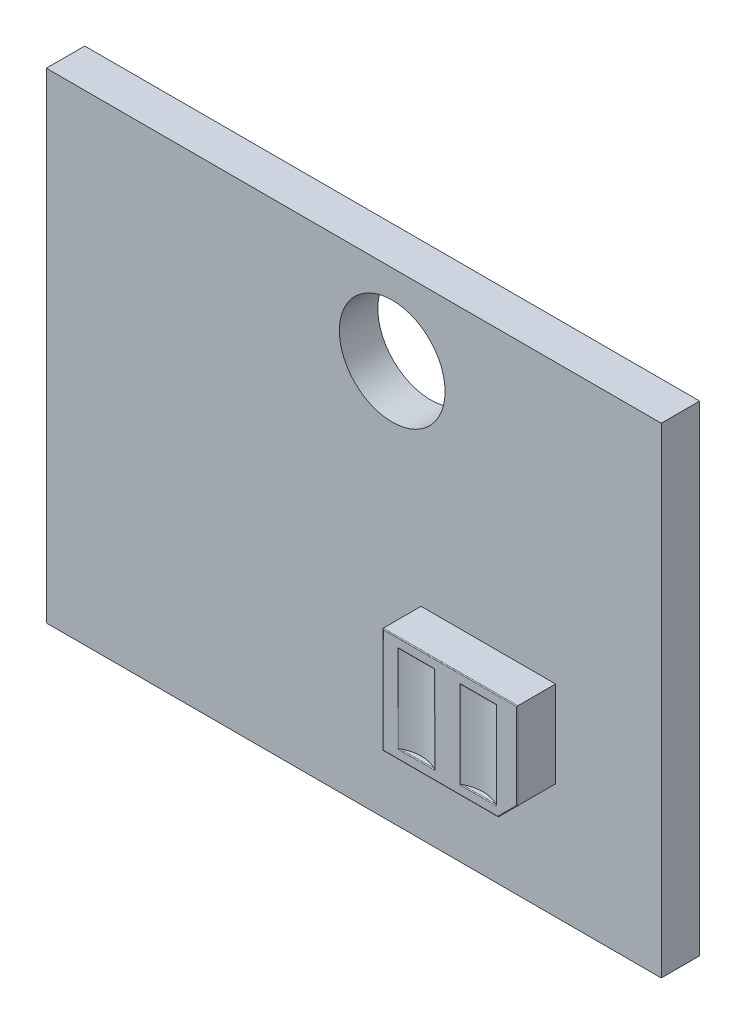
ISO-10303-21;
HEADER;
FILE_DESCRIPTION(('STEP AP214'),'2;1');
FILE_NAME('part.step','',(''),(''),'','','');
FILE_SCHEMA(('AUTOMOTIVE_DESIGN { 1 0 10303 214 1 1 1 1 }'));
ENDSEC;
DATA;
#1=APPLICATION_CONTEXT('core data for automotive mechanical design processes');
#2=APPLICATION_PROTOCOL_DEFINITION('international standard','automotive_design',2000,#1);
#3=PRODUCT_CONTEXT('',#1,'mechanical');
#4=PRODUCT('Part','Part','',(#3));
#5=PRODUCT_RELATED_PRODUCT_CATEGORY('part','',(#4));
#6=PRODUCT_DEFINITION_FORMATION('','',#4);
#7=PRODUCT_DEFINITION_CONTEXT('part definition',#1,'design');
#8=PRODUCT_DEFINITION('design','',#6,#7);
#9=PRODUCT_DEFINITION_SHAPE('','',#8);
#10=(LENGTH_UNIT() NAMED_UNIT(*) SI_UNIT(.MILLI.,.METRE.));
#11=(NAMED_UNIT(*) PLANE_ANGLE_UNIT() SI_UNIT($,.RADIAN.));
#12=(NAMED_UNIT(*) SI_UNIT($,.STERADIAN.) SOLID_ANGLE_UNIT());
#13=UNCERTAINTY_MEASURE_WITH_UNIT(LENGTH_MEASURE(1.E-05),#10,'distance_accuracy_value','');
#14=(GEOMETRIC_REPRESENTATION_CONTEXT(3) GLOBAL_UNCERTAINTY_ASSIGNED_CONTEXT((#13)) GLOBAL_UNIT_ASSIGNED_CONTEXT((#10,
#11,#12)) REPRESENTATION_CONTEXT('',''));
#15=CARTESIAN_POINT('',(0.,0.,0.));
#16=DIRECTION('',(0.,0.,1.));
#17=DIRECTION('',(1.,0.,0.));
#18=AXIS2_PLACEMENT_3D('',#15,#16,#17);
#19=CARTESIAN_POINT('',(1.5,-1.,2.));
#20=DIRECTION('',(0.,0.,-1.));
#21=DIRECTION('',(-1.,0.,0.));
#22=AXIS2_PLACEMENT_3D('',#19,#20,#21);
#23=PLANE('',#22);
#24=DIRECTION('',(-1.,0.,0.));
#25=VECTOR('',#24,1.);
#26=CARTESIAN_POINT('',(1.5,-3.52,2.));
#27=LINE('',#26,#25);
#28=CARTESIAN_POINT('',(2.86098672750231,-3.52,2.));
#29=VERTEX_POINT('',#28);
#30=CARTESIAN_POINT('',(1.90014058671939,-3.52,2.));
#31=VERTEX_POINT('',#30);
#32=EDGE_CURVE('E294',#29,#31,#27,.T.);
#33=ORIENTED_EDGE('',*,*,#32,.T.);
#34=DIRECTION('',(0.,-1.,0.));
#35=VECTOR('',#34,1.);
#36=CARTESIAN_POINT('',(1.90014058671939,-1.,2.));
#37=LINE('',#36,#35);
#38=CARTESIAN_POINT('',(1.90014058671939,-1.23,2.));
#39=VERTEX_POINT('',#38);
#40=EDGE_CURVE('E296',#31,#39,#37,.F.);
#41=ORIENTED_EDGE('',*,*,#40,.T.);
#42=DIRECTION('',(-1.,0.,0.));
#43=VECTOR('',#42,1.);
#44=CARTESIAN_POINT('',(2.85566536657195,-1.23,2.));
#45=LINE('',#44,#43);
#46=CARTESIAN_POINT('',(2.86098672750231,-1.23,2.));
#47=VERTEX_POINT('',#46);
#48=EDGE_CURVE('E290',#39,#47,#45,.F.);
#49=ORIENTED_EDGE('',*,*,#48,.T.);
#50=DIRECTION('',(0.,-1.,0.));
#51=VECTOR('',#50,1.);
#52=CARTESIAN_POINT('',(2.86098672750231,-1.,2.));
#53=LINE('',#52,#51);
#54=EDGE_CURVE('E292',#47,#29,#53,.T.);
#55=ORIENTED_EDGE('',*,*,#54,.T.);
#56=EDGE_LOOP('',(#33,#41,#49,#55));
#57=FACE_BOUND('',#56,.T.);
#58=DIRECTION('',(0.,1.,0.));
#59=VECTOR('',#58,1.);
#60=CARTESIAN_POINT('',(4.98,-1.,2.));
#61=LINE('',#60,#59);
#62=CARTESIAN_POINT('',(4.98,-3.24171572875254,2.));
#63=VERTEX_POINT('',#62);
#64=CARTESIAN_POINT('',(4.98,-1.02,2.));
#65=VERTEX_POINT('',#64);
#66=EDGE_CURVE('E285',#63,#65,#61,.T.);
#67=ORIENTED_EDGE('',*,*,#66,.T.);
#68=DIRECTION('',(-1.,0.,0.));
#69=VECTOR('',#68,1.);
#70=CARTESIAN_POINT('',(1.5,-1.02,2.));
#71=LINE('',#70,#69);
#72=CARTESIAN_POINT('',(1.52,-1.02,2.));
#73=VERTEX_POINT('',#72);
#74=EDGE_CURVE('E287',#65,#73,#71,.T.);
#75=ORIENTED_EDGE('',*,*,#74,.T.);
#76=DIRECTION('',(0.,-1.,0.));
#77=VECTOR('',#76,1.);
#78=CARTESIAN_POINT('',(1.52,-1.,2.));
#79=LINE('',#78,#77);
#80=CARTESIAN_POINT('',(1.52,-3.73,2.));
#81=VERTEX_POINT('',#80);
#82=EDGE_CURVE('E279',#73,#81,#79,.T.);
#83=ORIENTED_EDGE('',*,*,#82,.T.);
#84=DIRECTION('',(1.,0.,0.));
#85=VECTOR('',#84,1.);
#86=CARTESIAN_POINT('',(1.5,-3.73,2.));
#87=LINE('',#86,#85);
#88=CARTESIAN_POINT('',(4.49171572875254,-3.73,2.));
#89=VERTEX_POINT('',#88);
#90=EDGE_CURVE('E281',#81,#89,#87,.T.);
#91=ORIENTED_EDGE('',*,*,#90,.T.);
#92=DIRECTION('',(0.707106781186546,0.707106781186549,0.));
#93=VECTOR('',#92,1.);
#94=CARTESIAN_POINT('',(4.36085786437628,-3.86085786437626,2.));
#95=LINE('',#94,#93);
#96=EDGE_CURVE('E283',#89,#63,#95,.T.);
#97=ORIENTED_EDGE('',*,*,#96,.T.);
#98=EDGE_LOOP('',(#67,#75,#83,#91,#97));
#99=FACE_BOUND('',#98,.T.);
#100=DIRECTION('',(0.,-1.,0.));
#101=VECTOR('',#100,1.);
#102=CARTESIAN_POINT('',(4.46908404316876,-1.,2.));
#103=LINE('',#102,#101);
#104=CARTESIAN_POINT('',(4.46908404316876,-1.23,2.));
#105=VERTEX_POINT('',#104);
#106=CARTESIAN_POINT('',(4.46908404316876,-3.52,2.));
#107=VERTEX_POINT('',#106);
#108=EDGE_CURVE('E274',#105,#107,#103,.T.);
#109=ORIENTED_EDGE('',*,*,#108,.T.);
#110=DIRECTION('',(-1.,0.,0.));
#111=VECTOR('',#110,1.);
#112=CARTESIAN_POINT('',(3.51355926331619,-3.52,2.));
#113=LINE('',#112,#111);
#114=CARTESIAN_POINT('',(3.50823790238583,-3.52,2.));
#115=VERTEX_POINT('',#114);
#116=EDGE_CURVE('E276',#107,#115,#113,.T.);
#117=ORIENTED_EDGE('',*,*,#116,.T.);
#118=DIRECTION('',(0.,-1.,0.));
#119=VECTOR('',#118,1.);
#120=CARTESIAN_POINT('',(3.50823790238583,-1.,2.));
#121=LINE('',#120,#119);
#122=CARTESIAN_POINT('',(3.50823790238583,-1.23,2.));
#123=VERTEX_POINT('',#122);
#124=EDGE_CURVE('E270',#115,#123,#121,.F.);
#125=ORIENTED_EDGE('',*,*,#124,.T.);
#126=DIRECTION('',(-1.,0.,0.));
#127=VECTOR('',#126,1.);
#128=CARTESIAN_POINT('',(1.5,-1.23,2.));
#129=LINE('',#128,#127);
#130=EDGE_CURVE('E272',#123,#105,#129,.F.);
#131=ORIENTED_EDGE('',*,*,#130,.T.);
#132=EDGE_LOOP('',(#109,#117,#125,#131));
#133=FACE_BOUND('',#132,.T.);
#134=ADVANCED_FACE('F33',(#57,#99,#133),#23,.F.);
#135=CARTESIAN_POINT('',(-8.25,-6.25,1.));
#136=DIRECTION('',(0.,0.,1.));
#137=DIRECTION('',(1.,0.,0.));
#138=AXIS2_PLACEMENT_3D('',#135,#136,#137);
#139=PLANE('',#138);
#140=CARTESIAN_POINT('',(0.75,4.15,1.));
#141=DIRECTION('',(0.,0.,1.));
#142=DIRECTION('',(1.,0.,0.));
#143=AXIS2_PLACEMENT_3D('',#140,#141,#142);
#144=CIRCLE('',#143,1.375);
#145=CARTESIAN_POINT('',(2.125,4.15,1.));
#146=VERTEX_POINT('',#145);
#147=EDGE_CURVE('E228',#146,#146,#144,.T.);
#148=ORIENTED_EDGE('',*,*,#147,.F.);
#149=EDGE_LOOP('',(#148));
#150=FACE_BOUND('',#149,.T.);
#151=DIRECTION('',(0.,-1.,0.));
#152=VECTOR('',#151,1.);
#153=CARTESIAN_POINT('',(-8.25,6.25,1.));
#154=LINE('',#153,#152);
#155=CARTESIAN_POINT('',(-8.25,6.25,1.));
#156=VERTEX_POINT('',#155);
#157=CARTESIAN_POINT('',(-8.25,-6.25,1.));
#158=VERTEX_POINT('',#157);
#159=EDGE_CURVE('E245',#156,#158,#154,.T.);
#160=ORIENTED_EDGE('',*,*,#159,.T.);
#161=DIRECTION('',(1.,0.,0.));
#162=VECTOR('',#161,1.);
#163=CARTESIAN_POINT('',(-8.25,-6.25,1.));
#164=LINE('',#163,#162);
#165=CARTESIAN_POINT('',(7.75,-6.25,1.));
#166=VERTEX_POINT('',#165);
#167=EDGE_CURVE('E248',#158,#166,#164,.T.);
#168=ORIENTED_EDGE('',*,*,#167,.T.);
#169=DIRECTION('',(0.,1.,0.));
#170=VECTOR('',#169,1.);
#171=CARTESIAN_POINT('',(7.75,6.25,1.));
#172=LINE('',#171,#170);
#173=CARTESIAN_POINT('',(7.75,6.25,1.));
#174=VERTEX_POINT('',#173);
#175=EDGE_CURVE('E250',#166,#174,#172,.T.);
#176=ORIENTED_EDGE('',*,*,#175,.T.);
#177=DIRECTION('',(-1.,0.,0.));
#178=VECTOR('',#177,1.);
#179=CARTESIAN_POINT('',(-8.25,6.25,1.));
#180=LINE('',#179,#178);
#181=EDGE_CURVE('E252',#174,#156,#180,.T.);
#182=ORIENTED_EDGE('',*,*,#181,.T.);
#183=EDGE_LOOP('',(#160,#168,#176,#182));
#184=FACE_BOUND('',#183,.T.);
#185=DIRECTION('',(-1.,0.,0.));
#186=VECTOR('',#185,1.);
#187=CARTESIAN_POINT('',(-8.25,-3.75,1.));
#188=LINE('',#187,#186);
#189=CARTESIAN_POINT('',(4.5,-3.75,1.));
#190=VERTEX_POINT('',#189);
#191=CARTESIAN_POINT('',(1.5,-3.75,1.));
#192=VERTEX_POINT('',#191);
#193=EDGE_CURVE('E224',#190,#192,#188,.T.);
#194=ORIENTED_EDGE('',*,*,#193,.T.);
#195=DIRECTION('',(0.,1.,0.));
#196=VECTOR('',#195,1.);
#197=CARTESIAN_POINT('',(1.5,-6.25,1.));
#198=LINE('',#197,#196);
#199=CARTESIAN_POINT('',(1.5,-1.,1.));
#200=VERTEX_POINT('',#199);
#201=EDGE_CURVE('E201',#192,#200,#198,.T.);
#202=ORIENTED_EDGE('',*,*,#201,.T.);
#203=DIRECTION('',(1.,0.,0.));
#204=VECTOR('',#203,1.);
#205=CARTESIAN_POINT('',(-8.25,-1.,1.));
#206=LINE('',#205,#204);
#207=CARTESIAN_POINT('',(5.,-1.,1.));
#208=VERTEX_POINT('',#207);
#209=EDGE_CURVE('E212',#200,#208,#206,.T.);
#210=ORIENTED_EDGE('',*,*,#209,.T.);
#211=DIRECTION('',(0.,-1.,0.));
#212=VECTOR('',#211,1.);
#213=CARTESIAN_POINT('',(5.,-6.25,1.));
#214=LINE('',#213,#212);
#215=CARTESIAN_POINT('',(5.,-3.25,1.));
#216=VERTEX_POINT('',#215);
#217=EDGE_CURVE('E218',#208,#216,#214,.T.);
#218=ORIENTED_EDGE('',*,*,#217,.T.);
#219=DIRECTION('',(-0.707106781186546,-0.707106781186549,0.));
#220=VECTOR('',#219,1.);
#221=CARTESIAN_POINT('',(-3.12499999999997,-11.375,1.));
#222=LINE('',#221,#220);
#223=EDGE_CURVE('E230',#216,#190,#222,.T.);
#224=ORIENTED_EDGE('',*,*,#223,.T.);
#225=EDGE_LOOP('',(#194,#202,#210,#218,#224));
#226=FACE_BOUND('',#225,.T.);
#227=ADVANCED_FACE('F221',(#150,#184,#226),#139,.T.);
#228=CARTESIAN_POINT('',(-8.25,-6.25,0.));
#229=DIRECTION('',(0.,0.,1.));
#230=DIRECTION('',(1.,0.,0.));
#231=AXIS2_PLACEMENT_3D('',#228,#229,#230);
#232=PLANE('',#231);
#233=CARTESIAN_POINT('',(0.75,4.15,0.));
#234=DIRECTION('',(0.,0.,1.));
#235=DIRECTION('',(1.,0.,0.));
#236=AXIS2_PLACEMENT_3D('',#233,#234,#235);
#237=CIRCLE('',#236,1.375);
#238=CARTESIAN_POINT('',(2.125,4.15,0.));
#239=VERTEX_POINT('',#238);
#240=EDGE_CURVE('E225',#239,#239,#237,.T.);
#241=ORIENTED_EDGE('',*,*,#240,.T.);
#242=EDGE_LOOP('',(#241));
#243=FACE_BOUND('',#242,.T.);
#244=DIRECTION('',(0.,-1.,0.));
#245=VECTOR('',#244,1.);
#246=CARTESIAN_POINT('',(-8.25,6.25,0.));
#247=LINE('',#246,#245);
#248=CARTESIAN_POINT('',(-8.25,6.25,0.));
#249=VERTEX_POINT('',#248);
#250=CARTESIAN_POINT('',(-8.25,-6.25,0.));
#251=VERTEX_POINT('',#250);
#252=EDGE_CURVE('E236',#249,#251,#247,.T.);
#253=ORIENTED_EDGE('',*,*,#252,.F.);
#254=DIRECTION('',(-1.,0.,0.));
#255=VECTOR('',#254,1.);
#256=CARTESIAN_POINT('',(-8.25,6.25,0.));
#257=LINE('',#256,#255);
#258=CARTESIAN_POINT('',(7.75,6.25,0.));
#259=VERTEX_POINT('',#258);
#260=EDGE_CURVE('E243',#259,#249,#257,.T.);
#261=ORIENTED_EDGE('',*,*,#260,.F.);
#262=DIRECTION('',(0.,1.,0.));
#263=VECTOR('',#262,1.);
#264=CARTESIAN_POINT('',(7.75,6.25,0.));
#265=LINE('',#264,#263);
#266=CARTESIAN_POINT('',(7.75,-6.25,0.));
#267=VERTEX_POINT('',#266);
#268=EDGE_CURVE('E241',#267,#259,#265,.T.);
#269=ORIENTED_EDGE('',*,*,#268,.F.);
#270=DIRECTION('',(1.,0.,0.));
#271=VECTOR('',#270,1.);
#272=CARTESIAN_POINT('',(-8.25,-6.25,0.));
#273=LINE('',#272,#271);
#274=EDGE_CURVE('E239',#251,#267,#273,.T.);
#275=ORIENTED_EDGE('',*,*,#274,.F.);
#276=EDGE_LOOP('',(#253,#261,#269,#275));
#277=FACE_BOUND('',#276,.T.);
#278=ADVANCED_FACE('F701',(#243,#277),#232,.F.);
#279=CARTESIAN_POINT('',(-8.25,6.25,1.));
#280=DIRECTION('',(1.,0.,0.));
#281=DIRECTION('',(0.,0.,-1.));
#282=AXIS2_PLACEMENT_3D('',#279,#280,#281);
#283=PLANE('',#282);
#284=ORIENTED_EDGE('',*,*,#252,.T.);
#285=DIRECTION('',(0.,0.,-1.));
#286=VECTOR('',#285,1.);
#287=CARTESIAN_POINT('',(-8.25,-6.25,1.));
#288=LINE('',#287,#286);
#289=EDGE_CURVE('E263',#158,#251,#288,.T.);
#290=ORIENTED_EDGE('',*,*,#289,.F.);
#291=ORIENTED_EDGE('',*,*,#159,.F.);
#292=DIRECTION('',(0.,0.,-1.));
#293=VECTOR('',#292,1.);
#294=CARTESIAN_POINT('',(-8.25,6.25,1.));
#295=LINE('',#294,#293);
#296=EDGE_CURVE('E254',#156,#249,#295,.T.);
#297=ORIENTED_EDGE('',*,*,#296,.T.);
#298=EDGE_LOOP('',(#284,#290,#291,#297));
#299=FACE_BOUND('',#298,.T.);
#300=ADVANCED_FACE('F35',(#299),#283,.F.);
#301=CARTESIAN_POINT('',(-8.25,-6.25,1.));
#302=DIRECTION('',(0.,1.,0.));
#303=DIRECTION('',(0.,0.,1.));
#304=AXIS2_PLACEMENT_3D('',#301,#302,#303);
#305=PLANE('',#304);
#306=ORIENTED_EDGE('',*,*,#274,.T.);
#307=DIRECTION('',(0.,0.,-1.));
#308=VECTOR('',#307,1.);
#309=CARTESIAN_POINT('',(7.75,-6.25,1.));
#310=LINE('',#309,#308);
#311=EDGE_CURVE('E260',#166,#267,#310,.T.);
#312=ORIENTED_EDGE('',*,*,#311,.F.);
#313=ORIENTED_EDGE('',*,*,#167,.F.);
#314=ORIENTED_EDGE('',*,*,#289,.T.);
#315=EDGE_LOOP('',(#306,#312,#313,#314));
#316=FACE_BOUND('',#315,.T.);
#317=ADVANCED_FACE('F728',(#316),#305,.F.);
#318=CARTESIAN_POINT('',(7.75,6.25,1.));
#319=DIRECTION('',(-1.,0.,0.));
#320=DIRECTION('',(0.,0.,1.));
#321=AXIS2_PLACEMENT_3D('',#318,#319,#320);
#322=PLANE('',#321);
#323=ORIENTED_EDGE('',*,*,#268,.T.);
#324=DIRECTION('',(0.,0.,-1.));
#325=VECTOR('',#324,1.);
#326=CARTESIAN_POINT('',(7.75,6.25,1.));
#327=LINE('',#326,#325);
#328=EDGE_CURVE('E257',#174,#259,#327,.T.);
#329=ORIENTED_EDGE('',*,*,#328,.F.);
#330=ORIENTED_EDGE('',*,*,#175,.F.);
#331=ORIENTED_EDGE('',*,*,#311,.T.);
#332=EDGE_LOOP('',(#323,#329,#330,#331));
#333=FACE_BOUND('',#332,.T.);
#334=ADVANCED_FACE('F719',(#333),#322,.F.);
#335=CARTESIAN_POINT('',(-8.25,6.25,1.));
#336=DIRECTION('',(0.,-1.,0.));
#337=DIRECTION('',(0.,0.,-1.));
#338=AXIS2_PLACEMENT_3D('',#335,#336,#337);
#339=PLANE('',#338);
#340=ORIENTED_EDGE('',*,*,#260,.T.);
#341=ORIENTED_EDGE('',*,*,#296,.F.);
#342=ORIENTED_EDGE('',*,*,#181,.F.);
#343=ORIENTED_EDGE('',*,*,#328,.T.);
#344=EDGE_LOOP('',(#340,#341,#342,#343));
#345=FACE_BOUND('',#344,.T.);
#346=ADVANCED_FACE('F710',(#345),#339,.F.);
#347=CARTESIAN_POINT('',(0.75,4.15,1.));
#348=DIRECTION('',(0.,0.,-1.));
#349=DIRECTION('',(-1.,0.,0.));
#350=AXIS2_PLACEMENT_3D('',#347,#348,#349);
#351=CYLINDRICAL_SURFACE('',#350,1.375);
#352=ORIENTED_EDGE('',*,*,#147,.T.);
#353=EDGE_LOOP('',(#352));
#354=FACE_BOUND('',#353,.T.);
#355=ORIENTED_EDGE('',*,*,#240,.F.);
#356=EDGE_LOOP('',(#355));
#357=FACE_BOUND('',#356,.T.);
#358=ADVANCED_FACE('F693',(#354,#357),#351,.F.);
#359=CARTESIAN_POINT('',(1.5,-3.75,2.));
#360=DIRECTION('',(1.,0.,0.));
#361=DIRECTION('',(0.,1.,0.));
#362=AXIS2_PLACEMENT_3D('',#359,#360,#361);
#363=PLANE('',#362);
#364=DIRECTION('',(0.,0.,-1.));
#365=VECTOR('',#364,1.);
#366=CARTESIAN_POINT('',(1.5,-3.75,2.));
#367=LINE('',#366,#365);
#368=CARTESIAN_POINT('',(1.5,-3.75,1.98));
#369=VERTEX_POINT('',#368);
#370=EDGE_CURVE('E219',#369,#192,#367,.T.);
#371=ORIENTED_EDGE('',*,*,#370,.F.);
#372=DIRECTION('',(0.,-1.,0.));
#373=VECTOR('',#372,1.);
#374=CARTESIAN_POINT('',(1.5,-3.75,1.98));
#375=LINE('',#374,#373);
#376=CARTESIAN_POINT('',(1.5,-1.,1.98));
#377=VERTEX_POINT('',#376);
#378=EDGE_CURVE('E204',#369,#377,#375,.F.);
#379=ORIENTED_EDGE('',*,*,#378,.T.);
#380=DIRECTION('',(0.,0.,-1.));
#381=VECTOR('',#380,1.);
#382=CARTESIAN_POINT('',(1.5,-1.,2.));
#383=LINE('',#382,#381);
#384=EDGE_CURVE('E196',#377,#200,#383,.T.);
#385=ORIENTED_EDGE('',*,*,#384,.T.);
#386=ORIENTED_EDGE('',*,*,#201,.F.);
#387=EDGE_LOOP('',(#371,#379,#385,#386));
#388=FACE_BOUND('',#387,.T.);
#389=ADVANCED_FACE('F199',(#388),#363,.F.);
#390=CARTESIAN_POINT('',(4.5,-3.75,2.));
#391=DIRECTION('',(0.,1.,0.));
#392=DIRECTION('',(-1.,0.,0.));
#393=AXIS2_PLACEMENT_3D('',#390,#391,#392);
#394=PLANE('',#393);
#395=DIRECTION('',(0.,0.,-1.));
#396=VECTOR('',#395,1.);
#397=CARTESIAN_POINT('',(4.5,-3.75,2.));
#398=LINE('',#397,#396);
#399=CARTESIAN_POINT('',(4.5,-3.75,1.98));
#400=VERTEX_POINT('',#399);
#401=EDGE_CURVE('E456',#400,#190,#398,.T.);
#402=ORIENTED_EDGE('',*,*,#401,.F.);
#403=DIRECTION('',(1.,0.,0.));
#404=VECTOR('',#403,1.);
#405=CARTESIAN_POINT('',(4.5,-3.75,1.98));
#406=LINE('',#405,#404);
#407=EDGE_CURVE('E309',#400,#369,#406,.F.);
#408=ORIENTED_EDGE('',*,*,#407,.T.);
#409=ORIENTED_EDGE('',*,*,#370,.T.);
#410=ORIENTED_EDGE('',*,*,#193,.F.);
#411=EDGE_LOOP('',(#402,#408,#409,#410));
#412=FACE_BOUND('',#411,.T.);
#413=ADVANCED_FACE('F467',(#412),#394,.F.);
#414=CARTESIAN_POINT('',(5.,-3.25,2.));
#415=DIRECTION('',(-0.707106781186549,0.707106781186546,0.));
#416=DIRECTION('',(-0.707106781186546,-0.707106781186549,0.));
#417=AXIS2_PLACEMENT_3D('',#414,#415,#416);
#418=PLANE('',#417);
#419=DIRECTION('',(0.,0.,-1.));
#420=VECTOR('',#419,1.);
#421=CARTESIAN_POINT('',(5.,-3.25,2.));
#422=LINE('',#421,#420);
#423=CARTESIAN_POINT('',(5.,-3.25,1.98));
#424=VERTEX_POINT('',#423);
#425=EDGE_CURVE('E454',#424,#216,#422,.T.);
#426=ORIENTED_EDGE('',*,*,#425,.F.);
#427=DIRECTION('',(0.707106781186546,0.707106781186549,0.));
#428=VECTOR('',#427,1.);
#429=CARTESIAN_POINT('',(5.,-3.25,1.98));
#430=LINE('',#429,#428);
#431=EDGE_CURVE('E307',#424,#400,#430,.F.);
#432=ORIENTED_EDGE('',*,*,#431,.T.);
#433=ORIENTED_EDGE('',*,*,#401,.T.);
#434=ORIENTED_EDGE('',*,*,#223,.F.);
#435=EDGE_LOOP('',(#426,#432,#433,#434));
#436=FACE_BOUND('',#435,.T.);
#437=ADVANCED_FACE('F462',(#436),#418,.F.);
#438=CARTESIAN_POINT('',(5.,-1.,2.));
#439=DIRECTION('',(-1.,0.,0.));
#440=DIRECTION('',(0.,0.,1.));
#441=AXIS2_PLACEMENT_3D('',#438,#439,#440);
#442=PLANE('',#441);
#443=DIRECTION('',(0.,0.,-1.));
#444=VECTOR('',#443,1.);
#445=CARTESIAN_POINT('',(5.,-1.,2.));
#446=LINE('',#445,#444);
#447=CARTESIAN_POINT('',(5.,-1.,1.98));
#448=VERTEX_POINT('',#447);
#449=EDGE_CURVE('E208',#448,#208,#446,.T.);
#450=ORIENTED_EDGE('',*,*,#449,.F.);
#451=DIRECTION('',(0.,1.,0.));
#452=VECTOR('',#451,1.);
#453=CARTESIAN_POINT('',(5.,-1.,1.98));
#454=LINE('',#453,#452);
#455=EDGE_CURVE('E305',#448,#424,#454,.F.);
#456=ORIENTED_EDGE('',*,*,#455,.T.);
#457=ORIENTED_EDGE('',*,*,#425,.T.);
#458=ORIENTED_EDGE('',*,*,#217,.F.);
#459=EDGE_LOOP('',(#450,#456,#457,#458));
#460=FACE_BOUND('',#459,.T.);
#461=ADVANCED_FACE('F482',(#460),#442,.F.);
#462=CARTESIAN_POINT('',(1.5,-1.,2.));
#463=DIRECTION('',(0.,-1.,0.));
#464=DIRECTION('',(0.,0.,-1.));
#465=AXIS2_PLACEMENT_3D('',#462,#463,#464);
#466=PLANE('',#465);
#467=ORIENTED_EDGE('',*,*,#384,.F.);
#468=DIRECTION('',(-1.,0.,0.));
#469=VECTOR('',#468,1.);
#470=CARTESIAN_POINT('',(1.5,-1.,1.98));
#471=LINE('',#470,#469);
#472=EDGE_CURVE('E303',#377,#448,#471,.F.);
#473=ORIENTED_EDGE('',*,*,#472,.T.);
#474=ORIENTED_EDGE('',*,*,#449,.T.);
#475=ORIENTED_EDGE('',*,*,#209,.F.);
#476=EDGE_LOOP('',(#467,#473,#474,#475));
#477=FACE_BOUND('',#476,.T.);
#478=ADVANCED_FACE('F213',(#477),#466,.F.);
#479=CARTESIAN_POINT('',(2.38056365711085,-1.25,2.82428912257081));
#480=DIRECTION('',(0.,-1.,0.));
#481=DIRECTION('',(0.,0.,-1.));
#482=AXIS2_PLACEMENT_3D('',#479,#480,#481);
#483=CYLINDRICAL_SURFACE('',#482,0.95140642835826);
#484=CARTESIAN_POINT('',(2.38056365711085,-1.25,2.82428912257081));
#485=DIRECTION('',(0.,-1.,0.));
#486=DIRECTION('',(0.,0.,-1.));
#487=AXIS2_PLACEMENT_3D('',#484,#485,#486);
#488=CIRCLE('',#487,0.95140642835826);
#489=CARTESIAN_POINT('',(1.94198633276538,-1.25,1.98));
#490=VERTEX_POINT('',#489);
#491=CARTESIAN_POINT('',(2.81914098145632,-1.25,1.98));
#492=VERTEX_POINT('',#491);
#493=EDGE_CURVE('E209',#490,#492,#488,.T.);
#494=ORIENTED_EDGE('',*,*,#493,.F.);
#495=CARTESIAN_POINT('',(1.94198633276571,-1.25,1.97999999999983));
#496=CARTESIAN_POINT('',(1.93993675295173,-1.24999878160833,1.98106471582575));
#497=CARTESIAN_POINT('',(1.93789335792868,-1.24991539223715,1.98213566956907));
#498=CARTESIAN_POINT('',(1.93381444917598,-1.24956475343613,1.98429225266446));
#499=CARTESIAN_POINT('',(1.93177905978447,-1.24929638429543,1.98537793169867));
#500=CARTESIAN_POINT('',(1.92590873518013,-1.24822088569966,1.98853680792524));
#501=CARTESIAN_POINT('',(1.92211139892939,-1.24714600308415,1.9906149500728));
#502=CARTESIAN_POINT('',(1.91699554908182,-1.2448349841735,1.99345711157455));
#503=CARTESIAN_POINT('',(1.9155145748963,-1.24405237885127,1.99428546911793));
#504=CARTESIAN_POINT('',(1.9126624016866,-1.24220501883954,1.99588979719533));
#505=CARTESIAN_POINT('',(1.91129386251285,-1.24113512597495,1.99666445338981));
#506=CARTESIAN_POINT('',(1.91003187539905,-1.23989128867974,1.9973828193414));
#507=B_SPLINE_CURVE_WITH_KNOTS('',3,(#495,#496,#497,#498,#499,#500,#501,#502,#503,#504,#505,
#506),.UNSPECIFIED.,.F.,.F.,(4,2,2,2,2,4),(0.,0.00692143937366681,0.0138851475057156,
0.0271478806060184,0.0327331858918068,0.0384259374753639),.UNSPECIFIED.);
#508=CARTESIAN_POINT('',(1.9100318753987,-1.23989128868076,1.9973828193416));
#509=VERTEX_POINT('',#508);
#510=EDGE_CURVE('E352',#490,#509,#507,.T.);
#511=ORIENTED_EDGE('',*,*,#510,.T.);
#512=DIRECTION('',(0.,-1.,0.));
#513=VECTOR('',#512,1.);
#514=CARTESIAN_POINT('',(1.9100318753987,-1.25,1.9973828193416));
#515=LINE('',#514,#513);
#516=CARTESIAN_POINT('',(1.9100318753987,-3.51010871131924,1.9973828193416));
#517=VERTEX_POINT('',#516);
#518=EDGE_CURVE('E268',#509,#517,#515,.T.);
#519=ORIENTED_EDGE('',*,*,#518,.T.);
#520=CARTESIAN_POINT('',(1.9100318753987,-3.51010871131924,1.9973828193416));
#521=CARTESIAN_POINT('',(1.9111636150307,-3.5089899631656,1.99673862227858));
#522=CARTESIAN_POINT('',(1.91238480123171,-3.50801246946891,1.99604700264423));
#523=CARTESIAN_POINT('',(1.91493648220815,-3.50629412279259,1.99460993356394));
#524=CARTESIAN_POINT('',(1.91626577376116,-3.50555102062951,1.99386508551638));
#525=CARTESIAN_POINT('',(1.92017488054863,-3.50366257955739,1.99168783877315));
#526=CARTESIAN_POINT('',(1.92283524637719,-3.50273080812452,1.99022177053134));
#527=CARTESIAN_POINT('',(1.92827461234221,-3.50129136562545,1.98725952948016));
#528=CARTESIAN_POINT('',(1.93105444498464,-3.50078746542302,1.98576320561733));
#529=CARTESIAN_POINT('',(1.93521028090467,-3.50030448490393,1.98355318171546));
#530=CARTESIAN_POINT('',(1.93656944700625,-3.50018876076031,1.98283460719865));
#531=CARTESIAN_POINT('',(1.93928062897867,-3.50003704711138,1.98140965105941));
#532=CARTESIAN_POINT('',(1.94063257303701,-3.50000024393855,1.9807032202442));
#533=CARTESIAN_POINT('',(1.94198633276655,-3.5,1.9799999999994));
#534=B_SPLINE_CURVE_WITH_KNOTS('',3,(#520,#521,#522,#523,#524,#525,#526,#527,#528,#529,#530,
#531,#532,#533),.UNSPECIFIED.,.F.,.F.,(4,2,2,2,2,2,4),(0.,0.00511946838208136,
0.0101882011420184,0.0196727538814192,0.0292400519423778,0.03386367193953,0.0384393890027165),.UNSPECIFIED.);
#535=CARTESIAN_POINT('',(1.94198633276538,-3.5,1.98));
#536=VERTEX_POINT('',#535);
#537=EDGE_CURVE('E319',#517,#536,#534,.T.);
#538=ORIENTED_EDGE('',*,*,#537,.T.);
#539=CARTESIAN_POINT('',(2.38056365711085,-3.5,2.82428912257081));
#540=DIRECTION('',(0.,-1.,0.));
#541=DIRECTION('',(0.,0.,-1.));
#542=AXIS2_PLACEMENT_3D('',#539,#540,#541);
#543=CIRCLE('',#542,0.95140642835826);
#544=CARTESIAN_POINT('',(2.81914098145632,-3.5,1.98));
#545=VERTEX_POINT('',#544);
#546=EDGE_CURVE('E448',#536,#545,#543,.T.);
#547=ORIENTED_EDGE('',*,*,#546,.T.);
#548=CARTESIAN_POINT('',(2.81914098145632,-3.5,1.98));
#549=CARTESIAN_POINT('',(2.82119056127028,-3.50000121839168,1.98106471582591));
#550=CARTESIAN_POINT('',(2.82323395629331,-3.50008460776287,1.98213566956922));
#551=CARTESIAN_POINT('',(2.82731286504598,-3.5004352465639,1.9842922526646));
#552=CARTESIAN_POINT('',(2.82934825443747,-3.50070361570461,1.98537793169879));
#553=CARTESIAN_POINT('',(2.83521857904177,-3.5017791143004,1.98853680792534));
#554=CARTESIAN_POINT('',(2.83901591529247,-3.50285399691591,1.99061495007289));
#555=CARTESIAN_POINT('',(2.84413176513999,-3.50516501582656,1.99345711157462));
#556=CARTESIAN_POINT('',(2.84561273932548,-3.50594762114878,1.99428546911798));
#557=CARTESIAN_POINT('',(2.84846491253514,-3.50779498116049,1.99588979719535));
#558=CARTESIAN_POINT('',(2.84983345170886,-3.50886487402507,1.99666445338982));
#559=CARTESIAN_POINT('',(2.85109543882265,-3.51010871132026,1.9973828193414));
#560=B_SPLINE_CURVE_WITH_KNOTS('',3,(#548,#549,#550,#551,#552,#553,#554,#555,#556,#557,#558,
#559),.UNSPECIFIED.,.F.,.F.,(4,2,2,2,2,4),(0.,0.00692143937361445,0.0138851475056118,
0.0271478806058186,0.0327331858915266,0.0384259374750007),.UNSPECIFIED.);
#561=CARTESIAN_POINT('',(2.851095438823,-3.51010871131924,1.9973828193416));
#562=VERTEX_POINT('',#561);
#563=EDGE_CURVE('E326',#545,#562,#560,.T.);
#564=ORIENTED_EDGE('',*,*,#563,.T.);
#565=DIRECTION('',(0.,-1.,0.));
#566=VECTOR('',#565,1.);
#567=CARTESIAN_POINT('',(2.851095438823,-1.25,1.9973828193416));
#568=LINE('',#567,#566);
#569=CARTESIAN_POINT('',(2.851095438823,-1.23989128868076,1.9973828193416));
#570=VERTEX_POINT('',#569);
#571=EDGE_CURVE('E266',#562,#570,#568,.F.);
#572=ORIENTED_EDGE('',*,*,#571,.T.);
#573=CARTESIAN_POINT('',(2.851095438823,-1.23989128868076,1.9973828193416));
#574=CARTESIAN_POINT('',(2.849963699191,-1.24101003683441,1.99673862227858));
#575=CARTESIAN_POINT('',(2.84874251298999,-1.24198753053109,1.99604700264423));
#576=CARTESIAN_POINT('',(2.84619083201355,-1.24370587720741,1.99460993356394));
#577=CARTESIAN_POINT('',(2.84486154046054,-1.24444897937049,1.99386508551638));
#578=CARTESIAN_POINT('',(2.84095243367307,-1.24633742044261,1.99168783877315));
#579=CARTESIAN_POINT('',(2.8382920678445,-1.24726919187549,1.99022177053134));
#580=CARTESIAN_POINT('',(2.83285270187949,-1.24870863437455,1.98725952948016));
#581=CARTESIAN_POINT('',(2.83007286923706,-1.24921253457698,1.98576320561733));
#582=CARTESIAN_POINT('',(2.82591703331722,-1.24969551509605,1.98355318171556));
#583=CARTESIAN_POINT('',(2.82455786721584,-1.24981123923966,1.98283460719886));
#584=CARTESIAN_POINT('',(2.82184668524381,-1.24996295288859,1.98140965105981));
#585=CARTESIAN_POINT('',(2.82049474118566,-1.24999975606144,1.98070322024471));
#586=CARTESIAN_POINT('',(2.81914098145632,-1.25,1.98));
#587=B_SPLINE_CURVE_WITH_KNOTS('',3,(#573,#574,#575,#576,#577,#578,#579,#580,#581,#582,#583,
#584,#585,#586),.UNSPECIFIED.,.F.,.F.,(4,2,2,2,2,2,4),(0.,0.00511946838208151,
0.0101882011420187,0.0196727538814233,0.0292400519423795,0.0338636719388692,0.038439389001407),.UNSPECIFIED.);
#588=EDGE_CURVE('E357',#570,#492,#587,.T.);
#589=ORIENTED_EDGE('',*,*,#588,.T.);
#590=EDGE_LOOP('',(#494,#511,#519,#538,#547,#564,#572,#589));
#591=FACE_BOUND('',#590,.T.);
#592=ADVANCED_FACE('F331',(#591),#483,.F.);
#593=CARTESIAN_POINT('',(2.38056365711085,-1.25,2.82428912257081));
#594=DIRECTION('',(0.,-1.,0.));
#595=DIRECTION('',(0.,0.,-1.));
#596=AXIS2_PLACEMENT_3D('',#593,#594,#595);
#597=PLANE('',#596);
#598=ORIENTED_EDGE('',*,*,#493,.T.);
#599=DIRECTION('',(-1.,0.,0.));
#600=VECTOR('',#599,1.);
#601=CARTESIAN_POINT('',(1.90546194764975,-1.25,1.98));
#602=LINE('',#601,#600);
#603=EDGE_CURVE('E301',#492,#490,#602,.T.);
#604=ORIENTED_EDGE('',*,*,#603,.T.);
#605=EDGE_LOOP('',(#598,#604));
#606=FACE_BOUND('',#605,.T.);
#607=ADVANCED_FACE('F510',(#606),#597,.T.);
#608=CARTESIAN_POINT('',(2.38056365711085,-3.5,2.82428912257081));
#609=DIRECTION('',(0.,-1.,0.));
#610=DIRECTION('',(0.,0.,-1.));
#611=AXIS2_PLACEMENT_3D('',#608,#609,#610);
#612=PLANE('',#611);
#613=ORIENTED_EDGE('',*,*,#546,.F.);
#614=DIRECTION('',(-1.,0.,0.));
#615=VECTOR('',#614,1.);
#616=CARTESIAN_POINT('',(2.38056365711085,-3.5,1.98));
#617=LINE('',#616,#615);
#618=EDGE_CURVE('E299',#536,#545,#617,.F.);
#619=ORIENTED_EDGE('',*,*,#618,.T.);
#620=EDGE_LOOP('',(#613,#619));
#621=FACE_BOUND('',#620,.T.);
#622=ADVANCED_FACE('F506',(#621),#612,.F.);
#623=CARTESIAN_POINT('',(3.9886609727773,-1.25,2.82428912257081));
#624=DIRECTION('',(0.,-1.,0.));
#625=DIRECTION('',(0.,0.,-1.));
#626=AXIS2_PLACEMENT_3D('',#623,#624,#625);
#627=CYLINDRICAL_SURFACE('',#626,0.95140642835826);
#628=CARTESIAN_POINT('',(4.42723829712276,-3.5,1.98));
#629=CARTESIAN_POINT('',(4.42928787693672,-3.50000121839168,1.98106471582591));
#630=CARTESIAN_POINT('',(4.43133127195975,-3.50008460776287,1.98213566956922));
#631=CARTESIAN_POINT('',(4.43541018071243,-3.5004352465639,1.9842922526646));
#632=CARTESIAN_POINT('',(4.43744557010392,-3.50070361570461,1.9853779316988));
#633=CARTESIAN_POINT('',(4.44331589470821,-3.5017791143004,1.98853680792534));
#634=CARTESIAN_POINT('',(4.44711323095892,-3.50285399691591,1.99061495007289));
#635=CARTESIAN_POINT('',(4.45222908080643,-3.50516501582656,1.99345711157462));
#636=CARTESIAN_POINT('',(4.45371005499193,-3.50594762114878,1.99428546911798));
#637=CARTESIAN_POINT('',(4.45656222820159,-3.50779498116049,1.99588979719535));
#638=CARTESIAN_POINT('',(4.45793076737531,-3.50886487402507,1.99666445338982));
#639=CARTESIAN_POINT('',(4.4591927544891,-3.51010871132026,1.9973828193414));
#640=B_SPLINE_CURVE_WITH_KNOTS('',3,(#628,#629,#630,#631,#632,#633,#634,#635,#636,#637,#638,
#639),.UNSPECIFIED.,.F.,.F.,(4,2,2,2,2,4),(0.,0.00692143937361483,0.0138851475056124,
0.0271478806058188,0.0327331858915282,0.0384259374750024),.UNSPECIFIED.);
#641=CARTESIAN_POINT('',(4.42723829712276,-3.5,1.98));
#642=VERTEX_POINT('',#641);
#643=CARTESIAN_POINT('',(4.45919275448945,-3.51010871131924,1.9973828193416));
#644=VERTEX_POINT('',#643);
#645=EDGE_CURVE('E368',#642,#644,#640,.T.);
#646=ORIENTED_EDGE('',*,*,#645,.T.);
#647=DIRECTION('',(0.,-1.,0.));
#648=VECTOR('',#647,1.);
#649=CARTESIAN_POINT('',(4.45919275448945,-1.25,1.9973828193416));
#650=LINE('',#649,#648);
#651=CARTESIAN_POINT('',(4.45919275448945,-1.23989128868076,1.9973828193416));
#652=VERTEX_POINT('',#651);
#653=EDGE_CURVE('E60',#644,#652,#650,.F.);
#654=ORIENTED_EDGE('',*,*,#653,.T.);
#655=CARTESIAN_POINT('',(4.45919275448945,-1.23989128868076,1.9973828193416));
#656=CARTESIAN_POINT('',(4.45806101485744,-1.24101003683441,1.99673862227858));
#657=CARTESIAN_POINT('',(4.45683982865644,-1.24198753053109,1.99604700264423));
#658=CARTESIAN_POINT('',(4.45428814767999,-1.24370587720741,1.99460993356394));
#659=CARTESIAN_POINT('',(4.45295885612699,-1.24444897937049,1.99386508551639));
#660=CARTESIAN_POINT('',(4.44904974933951,-1.24633742044261,1.99168783877315));
#661=CARTESIAN_POINT('',(4.44638938351095,-1.24726919187549,1.99022177053134));
#662=CARTESIAN_POINT('',(4.44095001754593,-1.24870863437455,1.98725952948016));
#663=CARTESIAN_POINT('',(4.4381701849035,-1.24921253457698,1.98576320561733));
#664=CARTESIAN_POINT('',(4.43401434898367,-1.24969551509605,1.98355318171556));
#665=CARTESIAN_POINT('',(4.43265518288229,-1.24981123923966,1.98283460719886));
#666=CARTESIAN_POINT('',(4.42994400091025,-1.24996295288859,1.98140965105981));
#667=CARTESIAN_POINT('',(4.42859205685211,-1.24999975606144,1.98070322024471));
#668=CARTESIAN_POINT('',(4.42723829712276,-1.25,1.98));
#669=B_SPLINE_CURVE_WITH_KNOTS('',3,(#655,#656,#657,#658,#659,#660,#661,#662,#663,#664,#665,
#666,#667,#668),.UNSPECIFIED.,.F.,.F.,(4,2,2,2,2,2,4),(0.,0.00511946838208078,
0.0101882011420184,0.0196727538814218,0.029240051942377,0.0338636719388671,0.0384393890014074),.UNSPECIFIED.);
#670=CARTESIAN_POINT('',(4.42723829712276,-1.25,1.98));
#671=VERTEX_POINT('',#670);
#672=EDGE_CURVE('E11',#652,#671,#669,.T.);
#673=ORIENTED_EDGE('',*,*,#672,.T.);
#674=CARTESIAN_POINT('',(3.9886609727773,-1.25,2.82428912257081));
#675=DIRECTION('',(0.,-1.,0.));
#676=DIRECTION('',(0.,0.,1.));
#677=AXIS2_PLACEMENT_3D('',#674,#675,#676);
#678=CIRCLE('',#677,0.95140642835826);
#679=CARTESIAN_POINT('',(3.55008364843183,-1.25,1.98));
#680=VERTEX_POINT('',#679);
#681=EDGE_CURVE('E445',#680,#671,#678,.T.);
#682=ORIENTED_EDGE('',*,*,#681,.F.);
#683=CARTESIAN_POINT('',(3.55008364843215,-1.25,1.97999999999983));
#684=CARTESIAN_POINT('',(3.54803406861817,-1.24999878160833,1.98106471582575));
#685=CARTESIAN_POINT('',(3.54599067359513,-1.24991539223715,1.98213566956907));
#686=CARTESIAN_POINT('',(3.54191176484242,-1.24956475343613,1.98429225266446));
#687=CARTESIAN_POINT('',(3.53987637545091,-1.24929638429543,1.98537793169867));
#688=CARTESIAN_POINT('',(3.53400605084657,-1.24822088569966,1.98853680792524));
#689=CARTESIAN_POINT('',(3.53020871459584,-1.24714600308415,1.9906149500728));
#690=CARTESIAN_POINT('',(3.52509286474827,-1.2448349841735,1.99345711157455));
#691=CARTESIAN_POINT('',(3.52361189056275,-1.24405237885127,1.99428546911793));
#692=CARTESIAN_POINT('',(3.52075971735304,-1.24220501883954,1.99588979719533));
#693=CARTESIAN_POINT('',(3.5193911781793,-1.24113512597495,1.99666445338981));
#694=CARTESIAN_POINT('',(3.51812919106549,-1.23989128867974,1.9973828193414));
#695=B_SPLINE_CURVE_WITH_KNOTS('',3,(#683,#684,#685,#686,#687,#688,#689,#690,#691,#692,#693,
#694),.UNSPECIFIED.,.F.,.F.,(4,2,2,2,2,4),(0.,0.00692143937366681,0.0138851475057158,
0.0271478806060185,0.0327331858918071,0.0384259374753636),.UNSPECIFIED.);
#696=CARTESIAN_POINT('',(3.51812919106514,-1.23989128868076,1.9973828193416));
#697=VERTEX_POINT('',#696);
#698=EDGE_CURVE('E46',#680,#697,#695,.T.);
#699=ORIENTED_EDGE('',*,*,#698,.T.);
#700=DIRECTION('',(0.,-1.,0.));
#701=VECTOR('',#700,1.);
#702=CARTESIAN_POINT('',(3.51812919106514,-1.25,1.9973828193416));
#703=LINE('',#702,#701);
#704=CARTESIAN_POINT('',(3.51812919106514,-3.51010871131924,1.9973828193416));
#705=VERTEX_POINT('',#704);
#706=EDGE_CURVE('E53',#697,#705,#703,.T.);
#707=ORIENTED_EDGE('',*,*,#706,.T.);
#708=CARTESIAN_POINT('',(3.51812919106514,-3.51010871131924,1.9973828193416));
#709=CARTESIAN_POINT('',(3.51926093069715,-3.50898996316559,1.99673862227858));
#710=CARTESIAN_POINT('',(3.52048211689815,-3.50801246946891,1.99604700264423));
#711=CARTESIAN_POINT('',(3.5230337978746,-3.50629412279259,1.99460993356394));
#712=CARTESIAN_POINT('',(3.5243630894276,-3.50555102062951,1.99386508551638));
#713=CARTESIAN_POINT('',(3.52827219621508,-3.50366257955739,1.99168783877315));
#714=CARTESIAN_POINT('',(3.53093256204364,-3.50273080812452,1.99022177053134));
#715=CARTESIAN_POINT('',(3.53637192800866,-3.50129136562545,1.98725952948016));
#716=CARTESIAN_POINT('',(3.53915176065109,-3.50078746542302,1.98576320561733));
#717=CARTESIAN_POINT('',(3.54330759657111,-3.50030448490393,1.98355318171546));
#718=CARTESIAN_POINT('',(3.54466676267269,-3.50018876076031,1.98283460719865));
#719=CARTESIAN_POINT('',(3.54737794464511,-3.50003704711138,1.98140965105941));
#720=CARTESIAN_POINT('',(3.54872988870345,-3.50000024393855,1.9807032202442));
#721=CARTESIAN_POINT('',(3.55008364843299,-3.5,1.9799999999994));
#722=B_SPLINE_CURVE_WITH_KNOTS('',3,(#708,#709,#710,#711,#712,#713,#714,#715,#716,#717,#718,
#719,#720,#721),.UNSPECIFIED.,.F.,.F.,(4,2,2,2,2,2,4),(0.,0.00511946838208176,
0.0101882011420185,0.0196727538814195,0.0292400519423782,0.0338636719395308,0.0384393890027169),.UNSPECIFIED.);
#723=CARTESIAN_POINT('',(3.55008364843183,-3.5,1.98));
#724=VERTEX_POINT('',#723);
#725=EDGE_CURVE('E362',#705,#724,#722,.T.);
#726=ORIENTED_EDGE('',*,*,#725,.T.);
#727=CARTESIAN_POINT('',(3.9886609727773,-3.5,2.82428912257081));
#728=DIRECTION('',(0.,-1.,0.));
#729=DIRECTION('',(0.,0.,1.));
#730=AXIS2_PLACEMENT_3D('',#727,#728,#729);
#731=CIRCLE('',#730,0.95140642835826);
#732=EDGE_CURVE('E405',#724,#642,#731,.T.);
#733=ORIENTED_EDGE('',*,*,#732,.T.);
#734=EDGE_LOOP('',(#646,#654,#673,#682,#699,#707,#726,#733));
#735=FACE_BOUND('',#734,.T.);
#736=ADVANCED_FACE('F372',(#735),#627,.F.);
#737=CARTESIAN_POINT('',(3.9886609727773,-1.25,2.82428912257081));
#738=DIRECTION('',(0.,1.,0.));
#739=DIRECTION('',(0.,0.,1.));
#740=AXIS2_PLACEMENT_3D('',#737,#738,#739);
#741=PLANE('',#740);
#742=ORIENTED_EDGE('',*,*,#681,.T.);
#743=DIRECTION('',(-1.,0.,0.));
#744=VECTOR('',#743,1.);
#745=CARTESIAN_POINT('',(3.9886609727773,-1.25,1.98));
#746=LINE('',#745,#744);
#747=EDGE_CURVE('E317',#671,#680,#746,.T.);
#748=ORIENTED_EDGE('',*,*,#747,.T.);
#749=EDGE_LOOP('',(#742,#748));
#750=FACE_BOUND('',#749,.T.);
#751=ADVANCED_FACE('F498',(#750),#741,.F.);
#752=CARTESIAN_POINT('',(3.9886609727773,-3.5,2.82428912257081));
#753=DIRECTION('',(0.,1.,0.));
#754=DIRECTION('',(0.,0.,1.));
#755=AXIS2_PLACEMENT_3D('',#752,#753,#754);
#756=PLANE('',#755);
#757=ORIENTED_EDGE('',*,*,#732,.F.);
#758=DIRECTION('',(-1.,0.,0.));
#759=VECTOR('',#758,1.);
#760=CARTESIAN_POINT('',(4.4637626822384,-3.5,1.98));
#761=LINE('',#760,#759);
#762=EDGE_CURVE('E312',#724,#642,#761,.F.);
#763=ORIENTED_EDGE('',*,*,#762,.T.);
#764=EDGE_LOOP('',(#757,#763));
#765=FACE_BOUND('',#764,.T.);
#766=ADVANCED_FACE('F500',(#765),#756,.T.);
#767=CARTESIAN_POINT('',(2.86098672750231,-1.25,1.98));
#768=DIRECTION('',(0.,-1.,0.));
#769=DIRECTION('',(0.,0.,-1.));
#770=AXIS2_PLACEMENT_3D('',#767,#768,#769);
#771=CYLINDRICAL_SURFACE('',#770,0.02);
#772=CARTESIAN_POINT('',(2.86098672750231,-3.52,1.98));
#773=DIRECTION('',(-0.707106781186547,-0.707106781186547,0.));
#774=DIRECTION('',(-0.707106781186547,0.707106781186547,0.));
#775=AXIS2_PLACEMENT_3D('',#772,#773,#774);
#776=ELLIPSE('',#775,0.0282842712474619,0.02);
#777=EDGE_CURVE('E438',#29,#562,#776,.T.);
#778=ORIENTED_EDGE('',*,*,#777,.F.);
#779=ORIENTED_EDGE('',*,*,#54,.F.);
#780=CARTESIAN_POINT('',(2.86098672750231,-1.23,1.98));
#781=DIRECTION('',(0.707106781186547,-0.707106781186547,0.));
#782=DIRECTION('',(-0.707106781186547,-0.707106781186547,0.));
#783=AXIS2_PLACEMENT_3D('',#780,#781,#782);
#784=ELLIPSE('',#783,0.0282842712474619,0.02);
#785=EDGE_CURVE('E441',#570,#47,#784,.F.);
#786=ORIENTED_EDGE('',*,*,#785,.F.);
#787=ORIENTED_EDGE('',*,*,#571,.F.);
#788=EDGE_LOOP('',(#778,#779,#786,#787));
#789=FACE_BOUND('',#788,.T.);
#790=ADVANCED_FACE('F348',(#789),#771,.T.);
#791=CARTESIAN_POINT('',(2.38056365711085,-1.23,1.98));
#792=DIRECTION('',(1.,0.,0.));
#793=DIRECTION('',(0.,0.,-1.));
#794=AXIS2_PLACEMENT_3D('',#791,#792,#793);
#795=CYLINDRICAL_SURFACE('',#794,0.02);
#796=ORIENTED_EDGE('',*,*,#785,.T.);
#797=ORIENTED_EDGE('',*,*,#48,.F.);
#798=CARTESIAN_POINT('',(1.90014058671939,-1.23,1.98));
#799=DIRECTION('',(-0.707106781186547,-0.707106781186547,0.));
#800=DIRECTION('',(0.707106781186547,-0.707106781186547,0.));
#801=AXIS2_PLACEMENT_3D('',#798,#799,#800);
#802=ELLIPSE('',#801,0.0282842712474619,0.02);
#803=EDGE_CURVE('E436',#509,#39,#802,.T.);
#804=ORIENTED_EDGE('',*,*,#803,.F.);
#805=ORIENTED_EDGE('',*,*,#510,.F.);
#806=ORIENTED_EDGE('',*,*,#603,.F.);
#807=ORIENTED_EDGE('',*,*,#588,.F.);
#808=EDGE_LOOP('',(#796,#797,#804,#805,#806,#807));
#809=FACE_BOUND('',#808,.T.);
#810=ADVANCED_FACE('F341',(#809),#795,.T.);
#811=CARTESIAN_POINT('',(1.5,-3.52,1.98));
#812=DIRECTION('',(-1.,0.,0.));
#813=DIRECTION('',(0.,0.,1.));
#814=AXIS2_PLACEMENT_3D('',#811,#812,#813);
#815=CYLINDRICAL_SURFACE('',#814,0.02);
#816=ORIENTED_EDGE('',*,*,#618,.F.);
#817=ORIENTED_EDGE('',*,*,#537,.F.);
#818=CARTESIAN_POINT('',(1.90014058671939,-3.52,1.98));
#819=DIRECTION('',(0.707106781186547,-0.707106781186547,0.));
#820=DIRECTION('',(-0.707106781186547,-0.707106781186547,0.));
#821=AXIS2_PLACEMENT_3D('',#818,#819,#820);
#822=ELLIPSE('',#821,0.0282842712474619,0.02);
#823=EDGE_CURVE('E433',#31,#517,#822,.F.);
#824=ORIENTED_EDGE('',*,*,#823,.F.);
#825=ORIENTED_EDGE('',*,*,#32,.F.);
#826=ORIENTED_EDGE('',*,*,#777,.T.);
#827=ORIENTED_EDGE('',*,*,#563,.F.);
#828=EDGE_LOOP('',(#816,#817,#824,#825,#826,#827));
#829=FACE_BOUND('',#828,.T.);
#830=ADVANCED_FACE('F335',(#829),#815,.T.);
#831=CARTESIAN_POINT('',(1.90014058671939,-1.25,1.98));
#832=DIRECTION('',(0.,-1.,0.));
#833=DIRECTION('',(0.,0.,-1.));
#834=AXIS2_PLACEMENT_3D('',#831,#832,#833);
#835=CYLINDRICAL_SURFACE('',#834,0.02);
#836=ORIENTED_EDGE('',*,*,#803,.T.);
#837=ORIENTED_EDGE('',*,*,#40,.F.);
#838=ORIENTED_EDGE('',*,*,#823,.T.);
#839=ORIENTED_EDGE('',*,*,#518,.F.);
#840=EDGE_LOOP('',(#836,#837,#838,#839));
#841=FACE_BOUND('',#840,.T.);
#842=ADVANCED_FACE('F340',(#841),#835,.T.);
#843=CARTESIAN_POINT('',(4.36085786437628,-3.86085786437626,1.98));
#844=DIRECTION('',(0.707106781186546,0.707106781186549,0.));
#845=DIRECTION('',(-0.707106781186549,0.707106781186546,0.));
#846=AXIS2_PLACEMENT_3D('',#843,#844,#845);
#847=CYLINDRICAL_SURFACE('',#846,0.02);
#848=CARTESIAN_POINT('',(4.98,-3.24171572875254,1.98));
#849=DIRECTION('',(0.382683432365089,0.923879532511287,0.));
#850=DIRECTION('',(0.923879532511287,-0.382683432365089,0.));
#851=AXIS2_PLACEMENT_3D('',#848,#849,#850);
#852=ELLIPSE('',#851,0.0216478440058479,0.02);
#853=EDGE_CURVE('E427',#63,#424,#852,.T.);
#854=ORIENTED_EDGE('',*,*,#853,.F.);
#855=ORIENTED_EDGE('',*,*,#96,.F.);
#856=CARTESIAN_POINT('',(4.49171572875254,-3.73,1.98));
#857=DIRECTION('',(0.923879532511286,0.382683432365091,0.));
#858=DIRECTION('',(0.382683432365091,-0.923879532511286,0.));
#859=AXIS2_PLACEMENT_3D('',#856,#857,#858);
#860=ELLIPSE('',#859,0.0216478440058479,0.02);
#861=EDGE_CURVE('E430',#400,#89,#860,.F.);
#862=ORIENTED_EDGE('',*,*,#861,.F.);
#863=ORIENTED_EDGE('',*,*,#431,.F.);
#864=EDGE_LOOP('',(#854,#855,#862,#863));
#865=FACE_BOUND('',#864,.T.);
#866=ADVANCED_FACE('F489',(#865),#847,.T.);
#867=CARTESIAN_POINT('',(1.5,-3.73,1.98));
#868=DIRECTION('',(1.,0.,0.));
#869=DIRECTION('',(0.,1.,0.));
#870=AXIS2_PLACEMENT_3D('',#867,#868,#869);
#871=CYLINDRICAL_SURFACE('',#870,0.02);
#872=ORIENTED_EDGE('',*,*,#861,.T.);
#873=ORIENTED_EDGE('',*,*,#90,.F.);
#874=CARTESIAN_POINT('',(1.52,-3.73,1.98));
#875=DIRECTION('',(0.707106781186547,-0.707106781186547,0.));
#876=DIRECTION('',(-0.707106781186547,-0.707106781186547,0.));
#877=AXIS2_PLACEMENT_3D('',#874,#875,#876);
#878=ELLIPSE('',#877,0.0282842712474619,0.02);
#879=EDGE_CURVE('E424',#369,#81,#878,.F.);
#880=ORIENTED_EDGE('',*,*,#879,.F.);
#881=ORIENTED_EDGE('',*,*,#407,.F.);
#882=EDGE_LOOP('',(#872,#873,#880,#881));
#883=FACE_BOUND('',#882,.T.);
#884=ADVANCED_FACE('F472',(#883),#871,.T.);
#885=CARTESIAN_POINT('',(4.98,-1.,1.98));
#886=DIRECTION('',(0.,1.,0.));
#887=DIRECTION('',(0.,0.,1.));
#888=AXIS2_PLACEMENT_3D('',#885,#886,#887);
#889=CYLINDRICAL_SURFACE('',#888,0.02);
#890=ORIENTED_EDGE('',*,*,#853,.T.);
#891=ORIENTED_EDGE('',*,*,#455,.F.);
#892=CARTESIAN_POINT('',(4.98,-1.02,1.98));
#893=DIRECTION('',(-0.707106781186547,0.707106781186547,0.));
#894=DIRECTION('',(0.707106781186547,0.707106781186547,0.));
#895=AXIS2_PLACEMENT_3D('',#892,#893,#894);
#896=ELLIPSE('',#895,0.0282842712474619,0.02);
#897=EDGE_CURVE('E422',#65,#448,#896,.T.);
#898=ORIENTED_EDGE('',*,*,#897,.F.);
#899=ORIENTED_EDGE('',*,*,#66,.F.);
#900=EDGE_LOOP('',(#890,#891,#898,#899));
#901=FACE_BOUND('',#900,.T.);
#902=ADVANCED_FACE('F484',(#901),#889,.T.);
#903=CARTESIAN_POINT('',(1.52,-1.,1.98));
#904=DIRECTION('',(0.,-1.,0.));
#905=DIRECTION('',(1.,0.,0.));
#906=AXIS2_PLACEMENT_3D('',#903,#904,#905);
#907=CYLINDRICAL_SURFACE('',#906,0.02);
#908=ORIENTED_EDGE('',*,*,#879,.T.);
#909=ORIENTED_EDGE('',*,*,#82,.F.);
#910=CARTESIAN_POINT('',(1.52,-1.02,1.98));
#911=DIRECTION('',(-0.707106781186548,-0.707106781186547,0.));
#912=DIRECTION('',(0.707106781186547,-0.707106781186548,0.));
#913=AXIS2_PLACEMENT_3D('',#910,#911,#912);
#914=ELLIPSE('',#913,0.0282842712474619,0.02);
#915=EDGE_CURVE('E420',#377,#73,#914,.F.);
#916=ORIENTED_EDGE('',*,*,#915,.F.);
#917=ORIENTED_EDGE('',*,*,#378,.F.);
#918=EDGE_LOOP('',(#908,#909,#916,#917));
#919=FACE_BOUND('',#918,.T.);
#920=ADVANCED_FACE('F476',(#919),#907,.T.);
#921=CARTESIAN_POINT('',(1.5,-1.02,1.98));
#922=DIRECTION('',(-1.,0.,0.));
#923=DIRECTION('',(0.,0.,1.));
#924=AXIS2_PLACEMENT_3D('',#921,#922,#923);
#925=CYLINDRICAL_SURFACE('',#924,0.02);
#926=ORIENTED_EDGE('',*,*,#897,.T.);
#927=ORIENTED_EDGE('',*,*,#472,.F.);
#928=ORIENTED_EDGE('',*,*,#915,.T.);
#929=ORIENTED_EDGE('',*,*,#74,.F.);
#930=EDGE_LOOP('',(#926,#927,#928,#929));
#931=FACE_BOUND('',#930,.T.);
#932=ADVANCED_FACE('F392',(#931),#925,.T.);
#933=CARTESIAN_POINT('',(3.9886609727773,-1.23,1.98));
#934=DIRECTION('',(-1.,0.,0.));
#935=DIRECTION('',(0.,0.,1.));
#936=AXIS2_PLACEMENT_3D('',#933,#934,#935);
#937=CYLINDRICAL_SURFACE('',#936,0.02);
#938=ORIENTED_EDGE('',*,*,#747,.F.);
#939=ORIENTED_EDGE('',*,*,#672,.F.);
#940=CARTESIAN_POINT('',(4.46908404316876,-1.23,1.98));
#941=DIRECTION('',(0.707106781186547,-0.707106781186547,0.));
#942=DIRECTION('',(-0.707106781186547,-0.707106781186547,0.));
#943=AXIS2_PLACEMENT_3D('',#940,#941,#942);
#944=ELLIPSE('',#943,0.0282842712474619,0.02);
#945=EDGE_CURVE('E414',#105,#652,#944,.T.);
#946=ORIENTED_EDGE('',*,*,#945,.F.);
#947=ORIENTED_EDGE('',*,*,#130,.F.);
#948=CARTESIAN_POINT('',(3.50823790238583,-1.23,1.98));
#949=DIRECTION('',(-0.707106781186547,-0.707106781186547,0.));
#950=DIRECTION('',(-0.707106781186547,0.707106781186547,0.));
#951=AXIS2_PLACEMENT_3D('',#948,#949,#950);
#952=ELLIPSE('',#951,0.0282842712474619,0.02);
#953=EDGE_CURVE('E411',#697,#123,#952,.T.);
#954=ORIENTED_EDGE('',*,*,#953,.F.);
#955=ORIENTED_EDGE('',*,*,#698,.F.);
#956=EDGE_LOOP('',(#938,#939,#946,#947,#954,#955));
#957=FACE_BOUND('',#956,.T.);
#958=ADVANCED_FACE('F387',(#957),#937,.T.);
#959=CARTESIAN_POINT('',(4.46908404316876,-1.25,1.98));
#960=DIRECTION('',(0.,-1.,0.));
#961=DIRECTION('',(0.,0.,-1.));
#962=AXIS2_PLACEMENT_3D('',#959,#960,#961);
#963=CYLINDRICAL_SURFACE('',#962,0.02);
#964=ORIENTED_EDGE('',*,*,#653,.F.);
#965=CARTESIAN_POINT('',(4.46908404316876,-3.52,1.98));
#966=DIRECTION('',(0.707106781186547,0.707106781186547,0.));
#967=DIRECTION('',(0.707106781186547,-0.707106781186547,0.));
#968=AXIS2_PLACEMENT_3D('',#965,#966,#967);
#969=ELLIPSE('',#968,0.0282842712474619,0.02);
#970=EDGE_CURVE('E409',#107,#644,#969,.F.);
#971=ORIENTED_EDGE('',*,*,#970,.F.);
#972=ORIENTED_EDGE('',*,*,#108,.F.);
#973=ORIENTED_EDGE('',*,*,#945,.T.);
#974=EDGE_LOOP('',(#964,#971,#972,#973));
#975=FACE_BOUND('',#974,.T.);
#976=ADVANCED_FACE('F385',(#975),#963,.T.);
#977=CARTESIAN_POINT('',(3.50823790238583,-1.25,1.98));
#978=DIRECTION('',(0.,-1.,0.));
#979=DIRECTION('',(0.,0.,-1.));
#980=AXIS2_PLACEMENT_3D('',#977,#978,#979);
#981=CYLINDRICAL_SURFACE('',#980,0.02);
#982=ORIENTED_EDGE('',*,*,#953,.T.);
#983=ORIENTED_EDGE('',*,*,#124,.F.);
#984=CARTESIAN_POINT('',(3.50823790238583,-3.52,1.98));
#985=DIRECTION('',(0.707106781186547,-0.707106781186547,0.));
#986=DIRECTION('',(0.707106781186547,0.707106781186547,0.));
#987=AXIS2_PLACEMENT_3D('',#984,#985,#986);
#988=ELLIPSE('',#987,0.0282842712474619,0.02);
#989=EDGE_CURVE('E412',#705,#115,#988,.T.);
#990=ORIENTED_EDGE('',*,*,#989,.F.);
#991=ORIENTED_EDGE('',*,*,#706,.F.);
#992=EDGE_LOOP('',(#982,#983,#990,#991));
#993=FACE_BOUND('',#992,.T.);
#994=ADVANCED_FACE('F380',(#993),#981,.T.);
#995=CARTESIAN_POINT('',(1.5,-3.52,1.98));
#996=DIRECTION('',(1.,0.,0.));
#997=DIRECTION('',(0.,0.,-1.));
#998=AXIS2_PLACEMENT_3D('',#995,#996,#997);
#999=CYLINDRICAL_SURFACE('',#998,0.02);
#1000=ORIENTED_EDGE('',*,*,#645,.F.);
#1001=ORIENTED_EDGE('',*,*,#762,.F.);
#1002=ORIENTED_EDGE('',*,*,#725,.F.);
#1003=ORIENTED_EDGE('',*,*,#989,.T.);
#1004=ORIENTED_EDGE('',*,*,#116,.F.);
#1005=ORIENTED_EDGE('',*,*,#970,.T.);
#1006=EDGE_LOOP('',(#1000,#1001,#1002,#1003,#1004,#1005));
#1007=FACE_BOUND('',#1006,.T.);
#1008=ADVANCED_FACE('F376',(#1007),#999,.T.);
#1009=CLOSED_SHELL('',(#134,#227,#278,#300,#317,#334,#346,#358,#389,#413,#437,#461,#478,#592,
#607,#622,#736,#751,#766,#790,#810,#830,#842,#866,#884,#902,#920,#932,#958,#976,#994,#1008));
#1010=MANIFOLD_SOLID_BREP('B2',#1009);
#1011=ADVANCED_BREP_SHAPE_REPRESENTATION('',(#18,#1010),#14);
#1012=SHAPE_DEFINITION_REPRESENTATION(#9,#1011);
ENDSEC;
END-ISO-10303-21;
